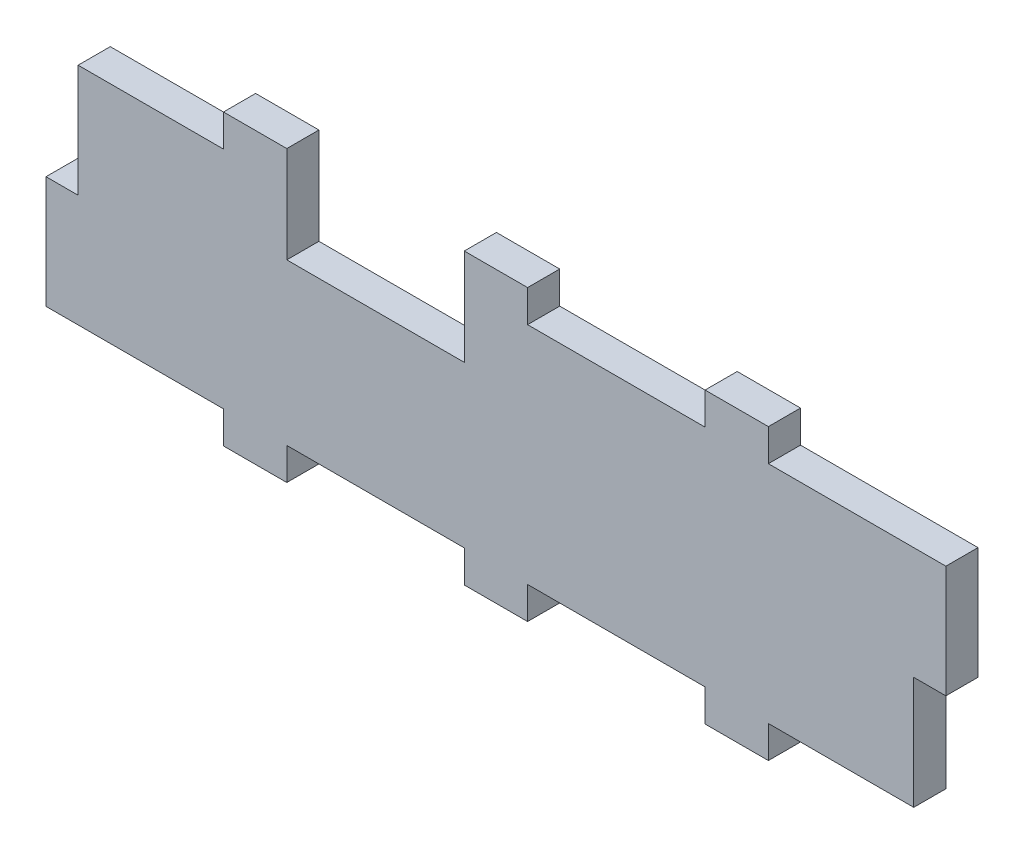
ISO-10303-21;
HEADER;
FILE_DESCRIPTION(('STEP AP214'),'2;1');
FILE_NAME('part.step','',(''),(''),'','','');
FILE_SCHEMA(('AUTOMOTIVE_DESIGN { 1 0 10303 214 1 1 1 1 }'));
ENDSEC;
DATA;
#1=APPLICATION_CONTEXT('core data for automotive mechanical design processes');
#2=APPLICATION_PROTOCOL_DEFINITION('international standard','automotive_design',2000,#1);
#3=PRODUCT_CONTEXT('',#1,'mechanical');
#4=PRODUCT('Part','Part','',(#3));
#5=PRODUCT_RELATED_PRODUCT_CATEGORY('part','',(#4));
#6=PRODUCT_DEFINITION_FORMATION('','',#4);
#7=PRODUCT_DEFINITION_CONTEXT('part definition',#1,'design');
#8=PRODUCT_DEFINITION('design','',#6,#7);
#9=PRODUCT_DEFINITION_SHAPE('','',#8);
#10=(LENGTH_UNIT() NAMED_UNIT(*) SI_UNIT(.MILLI.,.METRE.));
#11=(NAMED_UNIT(*) PLANE_ANGLE_UNIT() SI_UNIT($,.RADIAN.));
#12=(NAMED_UNIT(*) SI_UNIT($,.STERADIAN.) SOLID_ANGLE_UNIT());
#13=UNCERTAINTY_MEASURE_WITH_UNIT(LENGTH_MEASURE(1.E-05),#10,'distance_accuracy_value','');
#14=(GEOMETRIC_REPRESENTATION_CONTEXT(3) GLOBAL_UNCERTAINTY_ASSIGNED_CONTEXT((#13)) GLOBAL_UNIT_ASSIGNED_CONTEXT((#10,
#11,#12)) REPRESENTATION_CONTEXT('',''));
#15=CARTESIAN_POINT('',(0.,0.,0.));
#16=DIRECTION('',(0.,0.,1.));
#17=DIRECTION('',(1.,0.,0.));
#18=AXIS2_PLACEMENT_3D('',#15,#16,#17);
#19=CARTESIAN_POINT('',(0.,-17.5,5.));
#20=DIRECTION('',(0.,1.,0.));
#21=DIRECTION('',(-1.,0.,0.));
#22=AXIS2_PLACEMENT_3D('',#19,#20,#21);
#23=PLANE('',#22);
#24=DIRECTION('',(1.,0.,0.));
#25=VECTOR('',#24,1.);
#26=CARTESIAN_POINT('',(0.,-17.5,0.));
#27=LINE('',#26,#25);
#28=CARTESIAN_POINT('',(-70.,-17.5,0.));
#29=VERTEX_POINT('',#28);
#30=CARTESIAN_POINT('',(-42.3875,-17.5,0.));
#31=VERTEX_POINT('',#30);
#32=EDGE_CURVE('E284',#29,#31,#27,.T.);
#33=ORIENTED_EDGE('',*,*,#32,.T.);
#34=DIRECTION('',(0.,0.,-1.));
#35=VECTOR('',#34,1.);
#36=CARTESIAN_POINT('',(-42.3875,-17.5,5.));
#37=LINE('',#36,#35);
#38=CARTESIAN_POINT('',(-42.3875,-17.5,5.));
#39=VERTEX_POINT('',#38);
#40=EDGE_CURVE('E11',#39,#31,#37,.T.);
#41=ORIENTED_EDGE('',*,*,#40,.F.);
#42=DIRECTION('',(1.,0.,0.));
#43=VECTOR('',#42,1.);
#44=CARTESIAN_POINT('',(0.,-17.5,5.));
#45=LINE('',#44,#43);
#46=CARTESIAN_POINT('',(-70.,-17.5,5.));
#47=VERTEX_POINT('',#46);
#48=EDGE_CURVE('E358',#47,#39,#45,.T.);
#49=ORIENTED_EDGE('',*,*,#48,.F.);
#50=DIRECTION('',(0.,0.,-1.));
#51=VECTOR('',#50,1.);
#52=CARTESIAN_POINT('',(-70.,-17.5,5.));
#53=LINE('',#52,#51);
#54=EDGE_CURVE('E61',#47,#29,#53,.T.);
#55=ORIENTED_EDGE('',*,*,#54,.T.);
#56=EDGE_LOOP('',(#33,#41,#49,#55));
#57=FACE_BOUND('',#56,.T.);
#58=ADVANCED_FACE('F37',(#57),#23,.F.);
#59=CARTESIAN_POINT('',(-42.3875,0.,5.));
#60=DIRECTION('',(1.,0.,0.));
#61=DIRECTION('',(0.,0.,-1.));
#62=AXIS2_PLACEMENT_3D('',#59,#60,#61);
#63=PLANE('',#62);
#64=DIRECTION('',(0.,-1.,0.));
#65=VECTOR('',#64,1.);
#66=CARTESIAN_POINT('',(-42.3875,0.,0.));
#67=LINE('',#66,#65);
#68=CARTESIAN_POINT('',(-42.3875,-22.5,0.));
#69=VERTEX_POINT('',#68);
#70=EDGE_CURVE('E286',#31,#69,#67,.T.);
#71=ORIENTED_EDGE('',*,*,#70,.T.);
#72=DIRECTION('',(0.,0.,-1.));
#73=VECTOR('',#72,1.);
#74=CARTESIAN_POINT('',(-42.3875,-22.5,5.));
#75=LINE('',#74,#73);
#76=CARTESIAN_POINT('',(-42.3875,-22.5,5.));
#77=VERTEX_POINT('',#76);
#78=EDGE_CURVE('E45',#77,#69,#75,.T.);
#79=ORIENTED_EDGE('',*,*,#78,.F.);
#80=DIRECTION('',(0.,-1.,0.));
#81=VECTOR('',#80,1.);
#82=CARTESIAN_POINT('',(-42.3875,0.,5.));
#83=LINE('',#82,#81);
#84=EDGE_CURVE('E165',#39,#77,#83,.T.);
#85=ORIENTED_EDGE('',*,*,#84,.F.);
#86=ORIENTED_EDGE('',*,*,#40,.T.);
#87=EDGE_LOOP('',(#71,#79,#85,#86));
#88=FACE_BOUND('',#87,.T.);
#89=ADVANCED_FACE('F39',(#88),#63,.F.);
#90=CARTESIAN_POINT('',(0.,-22.5,5.));
#91=DIRECTION('',(0.,1.,0.));
#92=DIRECTION('',(0.,0.,1.));
#93=AXIS2_PLACEMENT_3D('',#90,#91,#92);
#94=PLANE('',#93);
#95=DIRECTION('',(1.,0.,0.));
#96=VECTOR('',#95,1.);
#97=CARTESIAN_POINT('',(0.,-22.5,0.));
#98=LINE('',#97,#96);
#99=CARTESIAN_POINT('',(-32.5375,-22.5,0.));
#100=VERTEX_POINT('',#99);
#101=EDGE_CURVE('E291',#69,#100,#98,.T.);
#102=ORIENTED_EDGE('',*,*,#101,.T.);
#103=DIRECTION('',(0.,0.,-1.));
#104=VECTOR('',#103,1.);
#105=CARTESIAN_POINT('',(-32.5375,-22.5,5.));
#106=LINE('',#105,#104);
#107=CARTESIAN_POINT('',(-32.5375,-22.5,5.));
#108=VERTEX_POINT('',#107);
#109=EDGE_CURVE('E414',#108,#100,#106,.T.);
#110=ORIENTED_EDGE('',*,*,#109,.F.);
#111=DIRECTION('',(1.,0.,0.));
#112=VECTOR('',#111,1.);
#113=CARTESIAN_POINT('',(0.,-22.5,5.));
#114=LINE('',#113,#112);
#115=EDGE_CURVE('E421',#77,#108,#114,.T.);
#116=ORIENTED_EDGE('',*,*,#115,.F.);
#117=ORIENTED_EDGE('',*,*,#78,.T.);
#118=EDGE_LOOP('',(#102,#110,#116,#117));
#119=FACE_BOUND('',#118,.T.);
#120=ADVANCED_FACE('F419',(#119),#94,.F.);
#121=CARTESIAN_POINT('',(-32.5375,0.,5.));
#122=DIRECTION('',(1.,0.,0.));
#123=DIRECTION('',(0.,0.,-1.));
#124=AXIS2_PLACEMENT_3D('',#121,#122,#123);
#125=PLANE('',#124);
#126=DIRECTION('',(0.,-1.,0.));
#127=VECTOR('',#126,1.);
#128=CARTESIAN_POINT('',(-32.5375,0.,0.));
#129=LINE('',#128,#127);
#130=CARTESIAN_POINT('',(-32.5375,-17.5,0.));
#131=VERTEX_POINT('',#130);
#132=EDGE_CURVE('E294',#131,#100,#129,.T.);
#133=ORIENTED_EDGE('',*,*,#132,.F.);
#134=DIRECTION('',(0.,0.,-1.));
#135=VECTOR('',#134,1.);
#136=CARTESIAN_POINT('',(-32.5375,-17.5,5.));
#137=LINE('',#136,#135);
#138=CARTESIAN_POINT('',(-32.5375,-17.5,5.));
#139=VERTEX_POINT('',#138);
#140=EDGE_CURVE('E412',#139,#131,#137,.T.);
#141=ORIENTED_EDGE('',*,*,#140,.F.);
#142=DIRECTION('',(0.,-1.,0.));
#143=VECTOR('',#142,1.);
#144=CARTESIAN_POINT('',(-32.5375,0.,5.));
#145=LINE('',#144,#143);
#146=EDGE_CURVE('E433',#139,#108,#145,.T.);
#147=ORIENTED_EDGE('',*,*,#146,.T.);
#148=ORIENTED_EDGE('',*,*,#109,.T.);
#149=EDGE_LOOP('',(#133,#141,#147,#148));
#150=FACE_BOUND('',#149,.T.);
#151=ADVANCED_FACE('F429',(#150),#125,.T.);
#152=CARTESIAN_POINT('',(-4.92499999999999,-17.5,0.));
#153=VERTEX_POINT('',#152);
#154=EDGE_CURVE('E289',#131,#153,#27,.T.);
#155=ORIENTED_EDGE('',*,*,#154,.T.);
#156=DIRECTION('',(0.,0.,-1.));
#157=VECTOR('',#156,1.);
#158=CARTESIAN_POINT('',(-4.92499999999999,-17.5,5.));
#159=LINE('',#158,#157);
#160=CARTESIAN_POINT('',(-4.92499999999999,-17.5,5.));
#161=VERTEX_POINT('',#160);
#162=EDGE_CURVE('E409',#161,#153,#159,.T.);
#163=ORIENTED_EDGE('',*,*,#162,.F.);
#164=EDGE_CURVE('E434',#139,#161,#45,.T.);
#165=ORIENTED_EDGE('',*,*,#164,.F.);
#166=ORIENTED_EDGE('',*,*,#140,.T.);
#167=EDGE_LOOP('',(#155,#163,#165,#166));
#168=FACE_BOUND('',#167,.T.);
#169=ADVANCED_FACE('F504',(#168),#23,.F.);
#170=CARTESIAN_POINT('',(-4.92499999999999,0.,5.));
#171=DIRECTION('',(1.,0.,0.));
#172=DIRECTION('',(0.,0.,-1.));
#173=AXIS2_PLACEMENT_3D('',#170,#171,#172);
#174=PLANE('',#173);
#175=DIRECTION('',(0.,-1.,0.));
#176=VECTOR('',#175,1.);
#177=CARTESIAN_POINT('',(-4.92499999999999,0.,0.));
#178=LINE('',#177,#176);
#179=CARTESIAN_POINT('',(-4.92499999999999,-22.5,0.));
#180=VERTEX_POINT('',#179);
#181=EDGE_CURVE('E297',#153,#180,#178,.T.);
#182=ORIENTED_EDGE('',*,*,#181,.T.);
#183=DIRECTION('',(0.,0.,-1.));
#184=VECTOR('',#183,1.);
#185=CARTESIAN_POINT('',(-4.92499999999999,-22.5,5.));
#186=LINE('',#185,#184);
#187=CARTESIAN_POINT('',(-4.92499999999999,-22.5,5.));
#188=VERTEX_POINT('',#187);
#189=EDGE_CURVE('E406',#188,#180,#186,.T.);
#190=ORIENTED_EDGE('',*,*,#189,.F.);
#191=DIRECTION('',(0.,-1.,0.));
#192=VECTOR('',#191,1.);
#193=CARTESIAN_POINT('',(-4.92499999999999,0.,5.));
#194=LINE('',#193,#192);
#195=EDGE_CURVE('E436',#161,#188,#194,.T.);
#196=ORIENTED_EDGE('',*,*,#195,.F.);
#197=ORIENTED_EDGE('',*,*,#162,.T.);
#198=EDGE_LOOP('',(#182,#190,#196,#197));
#199=FACE_BOUND('',#198,.T.);
#200=ADVANCED_FACE('F511',(#199),#174,.F.);
#201=CARTESIAN_POINT('',(0.,-22.5,5.));
#202=DIRECTION('',(0.,1.,0.));
#203=DIRECTION('',(0.,0.,1.));
#204=AXIS2_PLACEMENT_3D('',#201,#202,#203);
#205=PLANE('',#204);
#206=DIRECTION('',(1.,0.,0.));
#207=VECTOR('',#206,1.);
#208=CARTESIAN_POINT('',(0.,-22.5,0.));
#209=LINE('',#208,#207);
#210=CARTESIAN_POINT('',(4.92500000000001,-22.5,0.));
#211=VERTEX_POINT('',#210);
#212=EDGE_CURVE('E299',#180,#211,#209,.T.);
#213=ORIENTED_EDGE('',*,*,#212,.T.);
#214=DIRECTION('',(0.,0.,-1.));
#215=VECTOR('',#214,1.);
#216=CARTESIAN_POINT('',(4.92500000000001,-22.5,5.));
#217=LINE('',#216,#215);
#218=CARTESIAN_POINT('',(4.92500000000001,-22.5,5.));
#219=VERTEX_POINT('',#218);
#220=EDGE_CURVE('E404',#219,#211,#217,.T.);
#221=ORIENTED_EDGE('',*,*,#220,.F.);
#222=DIRECTION('',(1.,0.,0.));
#223=VECTOR('',#222,1.);
#224=CARTESIAN_POINT('',(0.,-22.5,5.));
#225=LINE('',#224,#223);
#226=EDGE_CURVE('E443',#188,#219,#225,.T.);
#227=ORIENTED_EDGE('',*,*,#226,.F.);
#228=ORIENTED_EDGE('',*,*,#189,.T.);
#229=EDGE_LOOP('',(#213,#221,#227,#228));
#230=FACE_BOUND('',#229,.T.);
#231=ADVANCED_FACE('F536',(#230),#205,.F.);
#232=CARTESIAN_POINT('',(4.92500000000001,0.,5.));
#233=DIRECTION('',(1.,0.,0.));
#234=DIRECTION('',(0.,0.,-1.));
#235=AXIS2_PLACEMENT_3D('',#232,#233,#234);
#236=PLANE('',#235);
#237=DIRECTION('',(0.,-1.,0.));
#238=VECTOR('',#237,1.);
#239=CARTESIAN_POINT('',(4.92500000000001,0.,0.));
#240=LINE('',#239,#238);
#241=CARTESIAN_POINT('',(4.92500000000001,-17.5,0.));
#242=VERTEX_POINT('',#241);
#243=EDGE_CURVE('E302',#242,#211,#240,.T.);
#244=ORIENTED_EDGE('',*,*,#243,.F.);
#245=DIRECTION('',(0.,0.,-1.));
#246=VECTOR('',#245,1.);
#247=CARTESIAN_POINT('',(4.92500000000001,-17.5,5.));
#248=LINE('',#247,#246);
#249=CARTESIAN_POINT('',(4.92500000000001,-17.5,5.));
#250=VERTEX_POINT('',#249);
#251=EDGE_CURVE('E402',#250,#242,#248,.T.);
#252=ORIENTED_EDGE('',*,*,#251,.F.);
#253=DIRECTION('',(0.,-1.,0.));
#254=VECTOR('',#253,1.);
#255=CARTESIAN_POINT('',(4.92500000000001,0.,5.));
#256=LINE('',#255,#254);
#257=EDGE_CURVE('E445',#250,#219,#256,.T.);
#258=ORIENTED_EDGE('',*,*,#257,.T.);
#259=ORIENTED_EDGE('',*,*,#220,.T.);
#260=EDGE_LOOP('',(#244,#252,#258,#259));
#261=FACE_BOUND('',#260,.T.);
#262=ADVANCED_FACE('F528',(#261),#236,.T.);
#263=CARTESIAN_POINT('',(32.5375,-17.5,0.));
#264=VERTEX_POINT('',#263);
#265=EDGE_CURVE('E305',#242,#264,#27,.T.);
#266=ORIENTED_EDGE('',*,*,#265,.T.);
#267=DIRECTION('',(0.,0.,-1.));
#268=VECTOR('',#267,1.);
#269=CARTESIAN_POINT('',(32.5375,-17.5,5.));
#270=LINE('',#269,#268);
#271=CARTESIAN_POINT('',(32.5375,-17.5,5.));
#272=VERTEX_POINT('',#271);
#273=EDGE_CURVE('E399',#272,#264,#270,.T.);
#274=ORIENTED_EDGE('',*,*,#273,.F.);
#275=EDGE_CURVE('E438',#250,#272,#45,.T.);
#276=ORIENTED_EDGE('',*,*,#275,.F.);
#277=ORIENTED_EDGE('',*,*,#251,.T.);
#278=EDGE_LOOP('',(#266,#274,#276,#277));
#279=FACE_BOUND('',#278,.T.);
#280=ADVANCED_FACE('F513',(#279),#23,.F.);
#281=CARTESIAN_POINT('',(32.5375,0.,5.));
#282=DIRECTION('',(1.,0.,0.));
#283=DIRECTION('',(0.,0.,-1.));
#284=AXIS2_PLACEMENT_3D('',#281,#282,#283);
#285=PLANE('',#284);
#286=DIRECTION('',(0.,-1.,0.));
#287=VECTOR('',#286,1.);
#288=CARTESIAN_POINT('',(32.5375,0.,0.));
#289=LINE('',#288,#287);
#290=CARTESIAN_POINT('',(32.5375,-22.5,0.));
#291=VERTEX_POINT('',#290);
#292=EDGE_CURVE('E306',#264,#291,#289,.T.);
#293=ORIENTED_EDGE('',*,*,#292,.T.);
#294=DIRECTION('',(0.,0.,-1.));
#295=VECTOR('',#294,1.);
#296=CARTESIAN_POINT('',(32.5375,-22.5,5.));
#297=LINE('',#296,#295);
#298=CARTESIAN_POINT('',(32.5375,-22.5,5.));
#299=VERTEX_POINT('',#298);
#300=EDGE_CURVE('E396',#299,#291,#297,.T.);
#301=ORIENTED_EDGE('',*,*,#300,.F.);
#302=DIRECTION('',(0.,-1.,0.));
#303=VECTOR('',#302,1.);
#304=CARTESIAN_POINT('',(32.5375,0.,5.));
#305=LINE('',#304,#303);
#306=EDGE_CURVE('E448',#272,#299,#305,.T.);
#307=ORIENTED_EDGE('',*,*,#306,.F.);
#308=ORIENTED_EDGE('',*,*,#273,.T.);
#309=EDGE_LOOP('',(#293,#301,#307,#308));
#310=FACE_BOUND('',#309,.T.);
#311=ADVANCED_FACE('F527',(#310),#285,.F.);
#312=CARTESIAN_POINT('',(0.,-22.5,5.));
#313=DIRECTION('',(0.,1.,0.));
#314=DIRECTION('',(0.,0.,1.));
#315=AXIS2_PLACEMENT_3D('',#312,#313,#314);
#316=PLANE('',#315);
#317=DIRECTION('',(1.,0.,0.));
#318=VECTOR('',#317,1.);
#319=CARTESIAN_POINT('',(0.,-22.5,0.));
#320=LINE('',#319,#318);
#321=CARTESIAN_POINT('',(42.3875,-22.5,0.));
#322=VERTEX_POINT('',#321);
#323=EDGE_CURVE('E308',#291,#322,#320,.T.);
#324=ORIENTED_EDGE('',*,*,#323,.T.);
#325=DIRECTION('',(0.,0.,-1.));
#326=VECTOR('',#325,1.);
#327=CARTESIAN_POINT('',(42.3875,-22.5,5.));
#328=LINE('',#327,#326);
#329=CARTESIAN_POINT('',(42.3875,-22.5,5.));
#330=VERTEX_POINT('',#329);
#331=EDGE_CURVE('E394',#330,#322,#328,.T.);
#332=ORIENTED_EDGE('',*,*,#331,.F.);
#333=DIRECTION('',(1.,0.,0.));
#334=VECTOR('',#333,1.);
#335=CARTESIAN_POINT('',(0.,-22.5,5.));
#336=LINE('',#335,#334);
#337=EDGE_CURVE('E450',#299,#330,#336,.T.);
#338=ORIENTED_EDGE('',*,*,#337,.F.);
#339=ORIENTED_EDGE('',*,*,#300,.T.);
#340=EDGE_LOOP('',(#324,#332,#338,#339));
#341=FACE_BOUND('',#340,.T.);
#342=ADVANCED_FACE('F524',(#341),#316,.F.);
#343=CARTESIAN_POINT('',(42.3875,0.,5.));
#344=DIRECTION('',(1.,0.,0.));
#345=DIRECTION('',(0.,0.,-1.));
#346=AXIS2_PLACEMENT_3D('',#343,#344,#345);
#347=PLANE('',#346);
#348=DIRECTION('',(0.,-1.,0.));
#349=VECTOR('',#348,1.);
#350=CARTESIAN_POINT('',(42.3875,0.,0.));
#351=LINE('',#350,#349);
#352=CARTESIAN_POINT('',(42.3875,-17.5,0.));
#353=VERTEX_POINT('',#352);
#354=EDGE_CURVE('E311',#353,#322,#351,.T.);
#355=ORIENTED_EDGE('',*,*,#354,.F.);
#356=DIRECTION('',(0.,0.,-1.));
#357=VECTOR('',#356,1.);
#358=CARTESIAN_POINT('',(42.3875,-17.5,5.));
#359=LINE('',#358,#357);
#360=CARTESIAN_POINT('',(42.3875,-17.5,5.));
#361=VERTEX_POINT('',#360);
#362=EDGE_CURVE('E392',#361,#353,#359,.T.);
#363=ORIENTED_EDGE('',*,*,#362,.F.);
#364=DIRECTION('',(0.,-1.,0.));
#365=VECTOR('',#364,1.);
#366=CARTESIAN_POINT('',(42.3875,0.,5.));
#367=LINE('',#366,#365);
#368=EDGE_CURVE('E452',#361,#330,#367,.T.);
#369=ORIENTED_EDGE('',*,*,#368,.T.);
#370=ORIENTED_EDGE('',*,*,#331,.T.);
#371=EDGE_LOOP('',(#355,#363,#369,#370));
#372=FACE_BOUND('',#371,.T.);
#373=ADVANCED_FACE('F516',(#372),#347,.T.);
#374=CARTESIAN_POINT('',(65.,-17.5,0.));
#375=VERTEX_POINT('',#374);
#376=EDGE_CURVE('E288',#353,#375,#27,.T.);
#377=ORIENTED_EDGE('',*,*,#376,.T.);
#378=DIRECTION('',(0.,0.,-1.));
#379=VECTOR('',#378,1.);
#380=CARTESIAN_POINT('',(65.,-17.5,5.));
#381=LINE('',#380,#379);
#382=CARTESIAN_POINT('',(65.,-17.5,5.));
#383=VERTEX_POINT('',#382);
#384=EDGE_CURVE('E389',#383,#375,#381,.T.);
#385=ORIENTED_EDGE('',*,*,#384,.F.);
#386=EDGE_CURVE('E455',#361,#383,#45,.T.);
#387=ORIENTED_EDGE('',*,*,#386,.F.);
#388=ORIENTED_EDGE('',*,*,#362,.T.);
#389=EDGE_LOOP('',(#377,#385,#387,#388));
#390=FACE_BOUND('',#389,.T.);
#391=ADVANCED_FACE('F505',(#390),#23,.F.);
#392=CARTESIAN_POINT('',(65.,0.,5.));
#393=DIRECTION('',(-1.,0.,0.));
#394=DIRECTION('',(0.,0.,1.));
#395=AXIS2_PLACEMENT_3D('',#392,#393,#394);
#396=PLANE('',#395);
#397=DIRECTION('',(0.,1.,0.));
#398=VECTOR('',#397,1.);
#399=CARTESIAN_POINT('',(65.,0.,0.));
#400=LINE('',#399,#398);
#401=CARTESIAN_POINT('',(65.,0.0249999999999972,0.));
#402=VERTEX_POINT('',#401);
#403=EDGE_CURVE('E314',#375,#402,#400,.T.);
#404=ORIENTED_EDGE('',*,*,#403,.T.);
#405=DIRECTION('',(0.,0.,-1.));
#406=VECTOR('',#405,1.);
#407=CARTESIAN_POINT('',(65.,0.0249999999999972,5.));
#408=LINE('',#407,#406);
#409=CARTESIAN_POINT('',(65.,0.0249999999999972,5.));
#410=VERTEX_POINT('',#409);
#411=EDGE_CURVE('E386',#410,#402,#408,.T.);
#412=ORIENTED_EDGE('',*,*,#411,.F.);
#413=DIRECTION('',(0.,1.,0.));
#414=VECTOR('',#413,1.);
#415=CARTESIAN_POINT('',(65.,0.,5.));
#416=LINE('',#415,#414);
#417=EDGE_CURVE('E456',#383,#410,#416,.T.);
#418=ORIENTED_EDGE('',*,*,#417,.F.);
#419=ORIENTED_EDGE('',*,*,#384,.T.);
#420=EDGE_LOOP('',(#404,#412,#418,#419));
#421=FACE_BOUND('',#420,.T.);
#422=ADVANCED_FACE('F515',(#421),#396,.F.);
#423=CARTESIAN_POINT('',(0.,0.0249999999999972,5.));
#424=DIRECTION('',(0.,1.,0.));
#425=DIRECTION('',(0.,0.,1.));
#426=AXIS2_PLACEMENT_3D('',#423,#424,#425);
#427=PLANE('',#426);
#428=DIRECTION('',(1.,0.,0.));
#429=VECTOR('',#428,1.);
#430=CARTESIAN_POINT('',(0.,0.0249999999999972,0.));
#431=LINE('',#430,#429);
#432=CARTESIAN_POINT('',(70.,0.0249999999999972,0.));
#433=VERTEX_POINT('',#432);
#434=EDGE_CURVE('E316',#402,#433,#431,.T.);
#435=ORIENTED_EDGE('',*,*,#434,.T.);
#436=DIRECTION('',(0.,0.,-1.));
#437=VECTOR('',#436,1.);
#438=CARTESIAN_POINT('',(70.,0.0249999999999972,5.));
#439=LINE('',#438,#437);
#440=CARTESIAN_POINT('',(70.,0.0249999999999972,5.));
#441=VERTEX_POINT('',#440);
#442=EDGE_CURVE('E384',#441,#433,#439,.T.);
#443=ORIENTED_EDGE('',*,*,#442,.F.);
#444=DIRECTION('',(1.,0.,0.));
#445=VECTOR('',#444,1.);
#446=CARTESIAN_POINT('',(0.,0.0249999999999972,5.));
#447=LINE('',#446,#445);
#448=EDGE_CURVE('E458',#410,#441,#447,.T.);
#449=ORIENTED_EDGE('',*,*,#448,.F.);
#450=ORIENTED_EDGE('',*,*,#411,.T.);
#451=EDGE_LOOP('',(#435,#443,#449,#450));
#452=FACE_BOUND('',#451,.T.);
#453=ADVANCED_FACE('F522',(#452),#427,.F.);
#454=CARTESIAN_POINT('',(70.,0.,5.));
#455=DIRECTION('',(1.,0.,0.));
#456=DIRECTION('',(0.,0.,-1.));
#457=AXIS2_PLACEMENT_3D('',#454,#455,#456);
#458=PLANE('',#457);
#459=DIRECTION('',(0.,-1.,0.));
#460=VECTOR('',#459,1.);
#461=CARTESIAN_POINT('',(70.,0.,0.));
#462=LINE('',#461,#460);
#463=CARTESIAN_POINT('',(70.,17.5,0.));
#464=VERTEX_POINT('',#463);
#465=EDGE_CURVE('E319',#464,#433,#462,.T.);
#466=ORIENTED_EDGE('',*,*,#465,.F.);
#467=DIRECTION('',(0.,0.,-1.));
#468=VECTOR('',#467,1.);
#469=CARTESIAN_POINT('',(70.,17.5,5.));
#470=LINE('',#469,#468);
#471=CARTESIAN_POINT('',(70.,17.5,5.));
#472=VERTEX_POINT('',#471);
#473=EDGE_CURVE('E382',#472,#464,#470,.T.);
#474=ORIENTED_EDGE('',*,*,#473,.F.);
#475=DIRECTION('',(0.,-1.,0.));
#476=VECTOR('',#475,1.);
#477=CARTESIAN_POINT('',(70.,0.,5.));
#478=LINE('',#477,#476);
#479=EDGE_CURVE('E460',#472,#441,#478,.T.);
#480=ORIENTED_EDGE('',*,*,#479,.T.);
#481=ORIENTED_EDGE('',*,*,#442,.T.);
#482=EDGE_LOOP('',(#466,#474,#480,#481));
#483=FACE_BOUND('',#482,.T.);
#484=ADVANCED_FACE('F641',(#483),#458,.T.);
#485=CARTESIAN_POINT('',(0.,17.5,5.));
#486=DIRECTION('',(0.,1.,0.));
#487=DIRECTION('',(0.,0.,1.));
#488=AXIS2_PLACEMENT_3D('',#485,#486,#487);
#489=PLANE('',#488);
#490=DIRECTION('',(1.,0.,0.));
#491=VECTOR('',#490,1.);
#492=CARTESIAN_POINT('',(0.,17.5,0.));
#493=LINE('',#492,#491);
#494=CARTESIAN_POINT('',(42.3874999999999,17.5,0.));
#495=VERTEX_POINT('',#494);
#496=EDGE_CURVE('E322',#495,#464,#493,.T.);
#497=ORIENTED_EDGE('',*,*,#496,.F.);
#498=DIRECTION('',(0.,0.,-1.));
#499=VECTOR('',#498,1.);
#500=CARTESIAN_POINT('',(42.3874999999999,17.5,5.));
#501=LINE('',#500,#499);
#502=CARTESIAN_POINT('',(42.3874999999999,17.5,5.));
#503=VERTEX_POINT('',#502);
#504=EDGE_CURVE('E380',#503,#495,#501,.T.);
#505=ORIENTED_EDGE('',*,*,#504,.F.);
#506=DIRECTION('',(1.,0.,0.));
#507=VECTOR('',#506,1.);
#508=CARTESIAN_POINT('',(0.,17.5,5.));
#509=LINE('',#508,#507);
#510=EDGE_CURVE('E279',#503,#472,#509,.T.);
#511=ORIENTED_EDGE('',*,*,#510,.T.);
#512=ORIENTED_EDGE('',*,*,#473,.T.);
#513=EDGE_LOOP('',(#497,#505,#511,#512));
#514=FACE_BOUND('',#513,.T.);
#515=ADVANCED_FACE('F570',(#514),#489,.T.);
#516=CARTESIAN_POINT('',(42.3874999999999,0.,5.));
#517=DIRECTION('',(1.,0.,0.));
#518=DIRECTION('',(0.,0.,-1.));
#519=AXIS2_PLACEMENT_3D('',#516,#517,#518);
#520=PLANE('',#519);
#521=DIRECTION('',(0.,-1.,0.));
#522=VECTOR('',#521,1.);
#523=CARTESIAN_POINT('',(42.3874999999999,0.,0.));
#524=LINE('',#523,#522);
#525=CARTESIAN_POINT('',(42.3874999999999,22.5,0.));
#526=VERTEX_POINT('',#525);
#527=EDGE_CURVE('E325',#526,#495,#524,.T.);
#528=ORIENTED_EDGE('',*,*,#527,.F.);
#529=DIRECTION('',(0.,0.,-1.));
#530=VECTOR('',#529,1.);
#531=CARTESIAN_POINT('',(42.3874999999999,22.5,5.));
#532=LINE('',#531,#530);
#533=CARTESIAN_POINT('',(42.3874999999999,22.5,5.));
#534=VERTEX_POINT('',#533);
#535=EDGE_CURVE('E378',#534,#526,#532,.T.);
#536=ORIENTED_EDGE('',*,*,#535,.F.);
#537=DIRECTION('',(0.,-1.,0.));
#538=VECTOR('',#537,1.);
#539=CARTESIAN_POINT('',(42.3874999999999,0.,5.));
#540=LINE('',#539,#538);
#541=EDGE_CURVE('E464',#534,#503,#540,.T.);
#542=ORIENTED_EDGE('',*,*,#541,.T.);
#543=ORIENTED_EDGE('',*,*,#504,.T.);
#544=EDGE_LOOP('',(#528,#536,#542,#543));
#545=FACE_BOUND('',#544,.T.);
#546=ADVANCED_FACE('F574',(#545),#520,.T.);
#547=CARTESIAN_POINT('',(0.,22.5,5.));
#548=DIRECTION('',(0.,1.,0.));
#549=DIRECTION('',(-1.,0.,0.));
#550=AXIS2_PLACEMENT_3D('',#547,#548,#549);
#551=PLANE('',#550);
#552=DIRECTION('',(1.,0.,0.));
#553=VECTOR('',#552,1.);
#554=CARTESIAN_POINT('',(0.,22.5,0.));
#555=LINE('',#554,#553);
#556=CARTESIAN_POINT('',(32.5374999999999,22.5,0.));
#557=VERTEX_POINT('',#556);
#558=EDGE_CURVE('E330',#557,#526,#555,.T.);
#559=ORIENTED_EDGE('',*,*,#558,.F.);
#560=DIRECTION('',(0.,0.,-1.));
#561=VECTOR('',#560,1.);
#562=CARTESIAN_POINT('',(32.5374999999999,22.5,5.));
#563=LINE('',#562,#561);
#564=CARTESIAN_POINT('',(32.5374999999999,22.5,5.));
#565=VERTEX_POINT('',#564);
#566=EDGE_CURVE('E376',#565,#557,#563,.T.);
#567=ORIENTED_EDGE('',*,*,#566,.F.);
#568=DIRECTION('',(1.,0.,0.));
#569=VECTOR('',#568,1.);
#570=CARTESIAN_POINT('',(0.,22.5,5.));
#571=LINE('',#570,#569);
#572=EDGE_CURVE('E467',#565,#534,#571,.T.);
#573=ORIENTED_EDGE('',*,*,#572,.T.);
#574=ORIENTED_EDGE('',*,*,#535,.T.);
#575=EDGE_LOOP('',(#559,#567,#573,#574));
#576=FACE_BOUND('',#575,.T.);
#577=ADVANCED_FACE('F578',(#576),#551,.T.);
#578=CARTESIAN_POINT('',(32.5374999999999,0.,5.));
#579=DIRECTION('',(1.,0.,0.));
#580=DIRECTION('',(0.,0.,-1.));
#581=AXIS2_PLACEMENT_3D('',#578,#579,#580);
#582=PLANE('',#581);
#583=DIRECTION('',(0.,-1.,0.));
#584=VECTOR('',#583,1.);
#585=CARTESIAN_POINT('',(32.5374999999999,0.,0.));
#586=LINE('',#585,#584);
#587=CARTESIAN_POINT('',(32.5374999999999,17.5,0.));
#588=VERTEX_POINT('',#587);
#589=EDGE_CURVE('E333',#557,#588,#586,.T.);
#590=ORIENTED_EDGE('',*,*,#589,.T.);
#591=DIRECTION('',(0.,0.,-1.));
#592=VECTOR('',#591,1.);
#593=CARTESIAN_POINT('',(32.5374999999999,17.5,5.));
#594=LINE('',#593,#592);
#595=CARTESIAN_POINT('',(32.5374999999999,17.5,5.));
#596=VERTEX_POINT('',#595);
#597=EDGE_CURVE('E374',#596,#588,#594,.T.);
#598=ORIENTED_EDGE('',*,*,#597,.F.);
#599=DIRECTION('',(0.,-1.,0.));
#600=VECTOR('',#599,1.);
#601=CARTESIAN_POINT('',(32.5374999999999,0.,5.));
#602=LINE('',#601,#600);
#603=EDGE_CURVE('E470',#565,#596,#602,.T.);
#604=ORIENTED_EDGE('',*,*,#603,.F.);
#605=ORIENTED_EDGE('',*,*,#566,.T.);
#606=EDGE_LOOP('',(#590,#598,#604,#605));
#607=FACE_BOUND('',#606,.T.);
#608=ADVANCED_FACE('F583',(#607),#582,.F.);
#609=CARTESIAN_POINT('',(4.92499999999987,17.5,0.));
#610=VERTEX_POINT('',#609);
#611=EDGE_CURVE('E327',#610,#588,#493,.T.);
#612=ORIENTED_EDGE('',*,*,#611,.F.);
#613=DIRECTION('',(0.,0.,-1.));
#614=VECTOR('',#613,1.);
#615=CARTESIAN_POINT('',(4.92499999999987,17.5,5.));
#616=LINE('',#615,#614);
#617=CARTESIAN_POINT('',(4.92499999999987,17.5,5.));
#618=VERTEX_POINT('',#617);
#619=EDGE_CURVE('E372',#618,#610,#616,.T.);
#620=ORIENTED_EDGE('',*,*,#619,.F.);
#621=EDGE_CURVE('E278',#618,#596,#509,.T.);
#622=ORIENTED_EDGE('',*,*,#621,.T.);
#623=ORIENTED_EDGE('',*,*,#597,.T.);
#624=EDGE_LOOP('',(#612,#620,#622,#623));
#625=FACE_BOUND('',#624,.T.);
#626=ADVANCED_FACE('F634',(#625),#489,.T.);
#627=CARTESIAN_POINT('',(4.92499999999987,0.,5.));
#628=DIRECTION('',(1.,0.,0.));
#629=DIRECTION('',(0.,0.,-1.));
#630=AXIS2_PLACEMENT_3D('',#627,#628,#629);
#631=PLANE('',#630);
#632=DIRECTION('',(0.,-1.,0.));
#633=VECTOR('',#632,1.);
#634=CARTESIAN_POINT('',(4.92499999999987,0.,0.));
#635=LINE('',#634,#633);
#636=CARTESIAN_POINT('',(4.92499999999987,22.5,0.));
#637=VERTEX_POINT('',#636);
#638=EDGE_CURVE('E336',#637,#610,#635,.T.);
#639=ORIENTED_EDGE('',*,*,#638,.F.);
#640=DIRECTION('',(0.,0.,-1.));
#641=VECTOR('',#640,1.);
#642=CARTESIAN_POINT('',(4.92499999999987,22.5,5.));
#643=LINE('',#642,#641);
#644=CARTESIAN_POINT('',(4.92499999999987,22.5,5.));
#645=VERTEX_POINT('',#644);
#646=EDGE_CURVE('E370',#645,#637,#643,.T.);
#647=ORIENTED_EDGE('',*,*,#646,.F.);
#648=DIRECTION('',(0.,-1.,0.));
#649=VECTOR('',#648,1.);
#650=CARTESIAN_POINT('',(4.92499999999987,0.,5.));
#651=LINE('',#650,#649);
#652=EDGE_CURVE('E472',#645,#618,#651,.T.);
#653=ORIENTED_EDGE('',*,*,#652,.T.);
#654=ORIENTED_EDGE('',*,*,#619,.T.);
#655=EDGE_LOOP('',(#639,#647,#653,#654));
#656=FACE_BOUND('',#655,.T.);
#657=ADVANCED_FACE('F591',(#656),#631,.T.);
#658=CARTESIAN_POINT('',(0.,22.5,5.));
#659=DIRECTION('',(0.,1.,0.));
#660=DIRECTION('',(-1.,0.,0.));
#661=AXIS2_PLACEMENT_3D('',#658,#659,#660);
#662=PLANE('',#661);
#663=DIRECTION('',(1.,0.,0.));
#664=VECTOR('',#663,1.);
#665=CARTESIAN_POINT('',(0.,22.5,0.));
#666=LINE('',#665,#664);
#667=CARTESIAN_POINT('',(-4.92500000000013,22.5,0.));
#668=VERTEX_POINT('',#667);
#669=EDGE_CURVE('E339',#668,#637,#666,.T.);
#670=ORIENTED_EDGE('',*,*,#669,.F.);
#671=DIRECTION('',(0.,0.,-1.));
#672=VECTOR('',#671,1.);
#673=CARTESIAN_POINT('',(-4.92500000000013,22.5,5.));
#674=LINE('',#673,#672);
#675=CARTESIAN_POINT('',(-4.92500000000013,22.5,5.));
#676=VERTEX_POINT('',#675);
#677=EDGE_CURVE('E368',#676,#668,#674,.T.);
#678=ORIENTED_EDGE('',*,*,#677,.F.);
#679=DIRECTION('',(1.,0.,0.));
#680=VECTOR('',#679,1.);
#681=CARTESIAN_POINT('',(0.,22.5,5.));
#682=LINE('',#681,#680);
#683=EDGE_CURVE('E475',#676,#645,#682,.T.);
#684=ORIENTED_EDGE('',*,*,#683,.T.);
#685=ORIENTED_EDGE('',*,*,#646,.T.);
#686=EDGE_LOOP('',(#670,#678,#684,#685));
#687=FACE_BOUND('',#686,.T.);
#688=ADVANCED_FACE('F595',(#687),#662,.T.);
#689=CARTESIAN_POINT('',(-4.92500000000013,0.,5.));
#690=DIRECTION('',(1.,0.,0.));
#691=DIRECTION('',(0.,0.,-1.));
#692=AXIS2_PLACEMENT_3D('',#689,#690,#691);
#693=PLANE('',#692);
#694=DIRECTION('',(0.,-1.,0.));
#695=VECTOR('',#694,1.);
#696=CARTESIAN_POINT('',(-4.92500000000013,0.,0.));
#697=LINE('',#696,#695);
#698=CARTESIAN_POINT('',(-4.92500000000013,7.5,0.));
#699=VERTEX_POINT('',#698);
#700=EDGE_CURVE('E52',#668,#699,#697,.T.);
#701=ORIENTED_EDGE('',*,*,#700,.T.);
#702=DIRECTION('',(0.,0.,-1.));
#703=VECTOR('',#702,1.);
#704=CARTESIAN_POINT('',(-4.92500000000013,7.5,5.));
#705=LINE('',#704,#703);
#706=CARTESIAN_POINT('',(-4.92500000000013,7.5,5.));
#707=VERTEX_POINT('',#706);
#708=EDGE_CURVE('E602',#707,#699,#705,.T.);
#709=ORIENTED_EDGE('',*,*,#708,.F.);
#710=DIRECTION('',(0.,-1.,0.));
#711=VECTOR('',#710,1.);
#712=CARTESIAN_POINT('',(-4.92500000000013,0.,5.));
#713=LINE('',#712,#711);
#714=EDGE_CURVE('E478',#676,#707,#713,.T.);
#715=ORIENTED_EDGE('',*,*,#714,.F.);
#716=ORIENTED_EDGE('',*,*,#677,.T.);
#717=EDGE_LOOP('',(#701,#709,#715,#716));
#718=FACE_BOUND('',#717,.T.);
#719=ADVANCED_FACE('F603',(#718),#693,.F.);
#720=CARTESIAN_POINT('',(-32.5375000000001,0.,5.));
#721=DIRECTION('',(1.,0.,0.));
#722=DIRECTION('',(0.,0.,-1.));
#723=AXIS2_PLACEMENT_3D('',#720,#721,#722);
#724=PLANE('',#723);
#725=DIRECTION('',(0.,-1.,0.));
#726=VECTOR('',#725,1.);
#727=CARTESIAN_POINT('',(-32.5375000000001,0.,0.));
#728=LINE('',#727,#726);
#729=CARTESIAN_POINT('',(-32.5375000000001,22.5,0.));
#730=VERTEX_POINT('',#729);
#731=CARTESIAN_POINT('',(-32.5375000000001,7.5,0.));
#732=VERTEX_POINT('',#731);
#733=EDGE_CURVE('E343',#730,#732,#728,.T.);
#734=ORIENTED_EDGE('',*,*,#733,.F.);
#735=DIRECTION('',(0.,0.,-1.));
#736=VECTOR('',#735,1.);
#737=CARTESIAN_POINT('',(-32.5375000000001,22.5,5.));
#738=LINE('',#737,#736);
#739=CARTESIAN_POINT('',(-32.5375000000001,22.5,5.));
#740=VERTEX_POINT('',#739);
#741=EDGE_CURVE('E366',#740,#730,#738,.T.);
#742=ORIENTED_EDGE('',*,*,#741,.F.);
#743=DIRECTION('',(0.,-1.,0.));
#744=VECTOR('',#743,1.);
#745=CARTESIAN_POINT('',(-32.5375000000001,0.,5.));
#746=LINE('',#745,#744);
#747=CARTESIAN_POINT('',(-32.5375000000001,7.5,5.));
#748=VERTEX_POINT('',#747);
#749=EDGE_CURVE('E480',#740,#748,#746,.T.);
#750=ORIENTED_EDGE('',*,*,#749,.T.);
#751=DIRECTION('',(0.,0.,-1.));
#752=VECTOR('',#751,1.);
#753=CARTESIAN_POINT('',(-32.5375000000001,7.5,5.));
#754=LINE('',#753,#752);
#755=EDGE_CURVE('E287',#748,#732,#754,.T.);
#756=ORIENTED_EDGE('',*,*,#755,.T.);
#757=EDGE_LOOP('',(#734,#742,#750,#756));
#758=FACE_BOUND('',#757,.T.);
#759=ADVANCED_FACE('F615',(#758),#724,.T.);
#760=CARTESIAN_POINT('',(0.,22.5,5.));
#761=DIRECTION('',(0.,1.,0.));
#762=DIRECTION('',(-1.,0.,0.));
#763=AXIS2_PLACEMENT_3D('',#760,#761,#762);
#764=PLANE('',#763);
#765=DIRECTION('',(1.,0.,0.));
#766=VECTOR('',#765,1.);
#767=CARTESIAN_POINT('',(0.,22.5,0.));
#768=LINE('',#767,#766);
#769=CARTESIAN_POINT('',(-42.3875000000001,22.5,0.));
#770=VERTEX_POINT('',#769);
#771=EDGE_CURVE('E346',#770,#730,#768,.T.);
#772=ORIENTED_EDGE('',*,*,#771,.F.);
#773=DIRECTION('',(0.,0.,-1.));
#774=VECTOR('',#773,1.);
#775=CARTESIAN_POINT('',(-42.3875000000001,22.5,5.));
#776=LINE('',#775,#774);
#777=CARTESIAN_POINT('',(-42.3875000000001,22.5,5.));
#778=VERTEX_POINT('',#777);
#779=EDGE_CURVE('E364',#778,#770,#776,.T.);
#780=ORIENTED_EDGE('',*,*,#779,.F.);
#781=DIRECTION('',(1.,0.,0.));
#782=VECTOR('',#781,1.);
#783=CARTESIAN_POINT('',(0.,22.5,5.));
#784=LINE('',#783,#782);
#785=EDGE_CURVE('E482',#778,#740,#784,.T.);
#786=ORIENTED_EDGE('',*,*,#785,.T.);
#787=ORIENTED_EDGE('',*,*,#741,.T.);
#788=EDGE_LOOP('',(#772,#780,#786,#787));
#789=FACE_BOUND('',#788,.T.);
#790=ADVANCED_FACE('F617',(#789),#764,.T.);
#791=CARTESIAN_POINT('',(-42.3875000000001,0.,5.));
#792=DIRECTION('',(1.,0.,0.));
#793=DIRECTION('',(0.,0.,-1.));
#794=AXIS2_PLACEMENT_3D('',#791,#792,#793);
#795=PLANE('',#794);
#796=DIRECTION('',(0.,-1.,0.));
#797=VECTOR('',#796,1.);
#798=CARTESIAN_POINT('',(-42.3875000000001,0.,0.));
#799=LINE('',#798,#797);
#800=CARTESIAN_POINT('',(-42.3875000000001,17.5,0.));
#801=VERTEX_POINT('',#800);
#802=EDGE_CURVE('E349',#770,#801,#799,.T.);
#803=ORIENTED_EDGE('',*,*,#802,.T.);
#804=DIRECTION('',(0.,0.,-1.));
#805=VECTOR('',#804,1.);
#806=CARTESIAN_POINT('',(-42.3875000000001,17.5,5.));
#807=LINE('',#806,#805);
#808=CARTESIAN_POINT('',(-42.3875000000001,17.5,5.));
#809=VERTEX_POINT('',#808);
#810=EDGE_CURVE('E362',#809,#801,#807,.T.);
#811=ORIENTED_EDGE('',*,*,#810,.F.);
#812=DIRECTION('',(0.,-1.,0.));
#813=VECTOR('',#812,1.);
#814=CARTESIAN_POINT('',(-42.3875000000001,0.,5.));
#815=LINE('',#814,#813);
#816=EDGE_CURVE('E276',#778,#809,#815,.T.);
#817=ORIENTED_EDGE('',*,*,#816,.F.);
#818=ORIENTED_EDGE('',*,*,#779,.T.);
#819=EDGE_LOOP('',(#803,#811,#817,#818));
#820=FACE_BOUND('',#819,.T.);
#821=ADVANCED_FACE('F490',(#820),#795,.F.);
#822=CARTESIAN_POINT('',(-65.,17.5,0.));
#823=VERTEX_POINT('',#822);
#824=EDGE_CURVE('E326',#823,#801,#493,.T.);
#825=ORIENTED_EDGE('',*,*,#824,.F.);
#826=DIRECTION('',(0.,0.,-1.));
#827=VECTOR('',#826,1.);
#828=CARTESIAN_POINT('',(-65.,17.5,5.));
#829=LINE('',#828,#827);
#830=CARTESIAN_POINT('',(-65.,17.5,5.));
#831=VERTEX_POINT('',#830);
#832=EDGE_CURVE('E260',#831,#823,#829,.T.);
#833=ORIENTED_EDGE('',*,*,#832,.F.);
#834=EDGE_CURVE('E274',#831,#809,#509,.T.);
#835=ORIENTED_EDGE('',*,*,#834,.T.);
#836=ORIENTED_EDGE('',*,*,#810,.T.);
#837=EDGE_LOOP('',(#825,#833,#835,#836));
#838=FACE_BOUND('',#837,.T.);
#839=ADVANCED_FACE('F495',(#838),#489,.T.);
#840=CARTESIAN_POINT('',(-65.,0.,5.));
#841=DIRECTION('',(-1.,0.,0.));
#842=DIRECTION('',(0.,0.,1.));
#843=AXIS2_PLACEMENT_3D('',#840,#841,#842);
#844=PLANE('',#843);
#845=DIRECTION('',(0.,1.,0.));
#846=VECTOR('',#845,1.);
#847=CARTESIAN_POINT('',(-65.,0.,0.));
#848=LINE('',#847,#846);
#849=CARTESIAN_POINT('',(-65.,-0.0250000000000053,0.));
#850=VERTEX_POINT('',#849);
#851=EDGE_CURVE('E256',#850,#823,#848,.T.);
#852=ORIENTED_EDGE('',*,*,#851,.F.);
#853=DIRECTION('',(0.,0.,-1.));
#854=VECTOR('',#853,1.);
#855=CARTESIAN_POINT('',(-65.,-0.0250000000000053,5.));
#856=LINE('',#855,#854);
#857=CARTESIAN_POINT('',(-65.,-0.0250000000000053,5.));
#858=VERTEX_POINT('',#857);
#859=EDGE_CURVE('E250',#858,#850,#856,.T.);
#860=ORIENTED_EDGE('',*,*,#859,.F.);
#861=DIRECTION('',(0.,1.,0.));
#862=VECTOR('',#861,1.);
#863=CARTESIAN_POINT('',(-65.,0.,5.));
#864=LINE('',#863,#862);
#865=EDGE_CURVE('E254',#858,#831,#864,.T.);
#866=ORIENTED_EDGE('',*,*,#865,.T.);
#867=ORIENTED_EDGE('',*,*,#832,.T.);
#868=EDGE_LOOP('',(#852,#860,#866,#867));
#869=FACE_BOUND('',#868,.T.);
#870=ADVANCED_FACE('F252',(#869),#844,.T.);
#871=CARTESIAN_POINT('',(0.,-0.0250000000000192,5.));
#872=DIRECTION('',(0.,-1.,0.));
#873=DIRECTION('',(1.,0.,0.));
#874=AXIS2_PLACEMENT_3D('',#871,#872,#873);
#875=PLANE('',#874);
#876=DIRECTION('',(-1.,0.,0.));
#877=VECTOR('',#876,1.);
#878=CARTESIAN_POINT('',(0.,-0.0250000000000192,0.));
#879=LINE('',#878,#877);
#880=CARTESIAN_POINT('',(-70.,-0.0250000000000042,0.));
#881=VERTEX_POINT('',#880);
#882=EDGE_CURVE('E353',#850,#881,#879,.T.);
#883=ORIENTED_EDGE('',*,*,#882,.T.);
#884=DIRECTION('',(0.,0.,-1.));
#885=VECTOR('',#884,1.);
#886=CARTESIAN_POINT('',(-70.,-0.0250000000000042,5.));
#887=LINE('',#886,#885);
#888=CARTESIAN_POINT('',(-70.,-0.0250000000000042,5.));
#889=VERTEX_POINT('',#888);
#890=EDGE_CURVE('E261',#889,#881,#887,.T.);
#891=ORIENTED_EDGE('',*,*,#890,.F.);
#892=DIRECTION('',(-1.,0.,0.));
#893=VECTOR('',#892,1.);
#894=CARTESIAN_POINT('',(0.,-0.0250000000000192,5.));
#895=LINE('',#894,#893);
#896=EDGE_CURVE('E264',#858,#889,#895,.T.);
#897=ORIENTED_EDGE('',*,*,#896,.F.);
#898=ORIENTED_EDGE('',*,*,#859,.T.);
#899=EDGE_LOOP('',(#883,#891,#897,#898));
#900=FACE_BOUND('',#899,.T.);
#901=ADVANCED_FACE('F265',(#900),#875,.F.);
#902=CARTESIAN_POINT('',(-70.,0.,5.));
#903=DIRECTION('',(-1.,0.,0.));
#904=DIRECTION('',(0.,-1.,0.));
#905=AXIS2_PLACEMENT_3D('',#902,#903,#904);
#906=PLANE('',#905);
#907=DIRECTION('',(0.,1.,0.));
#908=VECTOR('',#907,1.);
#909=CARTESIAN_POINT('',(-70.,0.,0.));
#910=LINE('',#909,#908);
#911=EDGE_CURVE('E355',#29,#881,#910,.T.);
#912=ORIENTED_EDGE('',*,*,#911,.F.);
#913=ORIENTED_EDGE('',*,*,#54,.F.);
#914=DIRECTION('',(0.,1.,0.));
#915=VECTOR('',#914,1.);
#916=CARTESIAN_POINT('',(-70.,0.,5.));
#917=LINE('',#916,#915);
#918=EDGE_CURVE('E268',#47,#889,#917,.T.);
#919=ORIENTED_EDGE('',*,*,#918,.T.);
#920=ORIENTED_EDGE('',*,*,#890,.T.);
#921=EDGE_LOOP('',(#912,#913,#919,#920));
#922=FACE_BOUND('',#921,.T.);
#923=ADVANCED_FACE('F496',(#922),#906,.T.);
#924=CARTESIAN_POINT('',(0.,0.,5.));
#925=DIRECTION('',(0.,0.,1.));
#926=DIRECTION('',(1.,0.,0.));
#927=AXIS2_PLACEMENT_3D('',#924,#925,#926);
#928=PLANE('',#927);
#929=ORIENTED_EDGE('',*,*,#714,.T.);
#930=DIRECTION('',(-1.,0.,0.));
#931=VECTOR('',#930,1.);
#932=CARTESIAN_POINT('',(-4.92500000000013,7.5,5.));
#933=LINE('',#932,#931);
#934=EDGE_CURVE('E600',#707,#748,#933,.T.);
#935=ORIENTED_EDGE('',*,*,#934,.T.);
#936=ORIENTED_EDGE('',*,*,#749,.F.);
#937=ORIENTED_EDGE('',*,*,#785,.F.);
#938=ORIENTED_EDGE('',*,*,#816,.T.);
#939=ORIENTED_EDGE('',*,*,#834,.F.);
#940=ORIENTED_EDGE('',*,*,#865,.F.);
#941=ORIENTED_EDGE('',*,*,#896,.T.);
#942=ORIENTED_EDGE('',*,*,#918,.F.);
#943=ORIENTED_EDGE('',*,*,#48,.T.);
#944=ORIENTED_EDGE('',*,*,#84,.T.);
#945=ORIENTED_EDGE('',*,*,#115,.T.);
#946=ORIENTED_EDGE('',*,*,#146,.F.);
#947=ORIENTED_EDGE('',*,*,#164,.T.);
#948=ORIENTED_EDGE('',*,*,#195,.T.);
#949=ORIENTED_EDGE('',*,*,#226,.T.);
#950=ORIENTED_EDGE('',*,*,#257,.F.);
#951=ORIENTED_EDGE('',*,*,#275,.T.);
#952=ORIENTED_EDGE('',*,*,#306,.T.);
#953=ORIENTED_EDGE('',*,*,#337,.T.);
#954=ORIENTED_EDGE('',*,*,#368,.F.);
#955=ORIENTED_EDGE('',*,*,#386,.T.);
#956=ORIENTED_EDGE('',*,*,#417,.T.);
#957=ORIENTED_EDGE('',*,*,#448,.T.);
#958=ORIENTED_EDGE('',*,*,#479,.F.);
#959=ORIENTED_EDGE('',*,*,#510,.F.);
#960=ORIENTED_EDGE('',*,*,#541,.F.);
#961=ORIENTED_EDGE('',*,*,#572,.F.);
#962=ORIENTED_EDGE('',*,*,#603,.T.);
#963=ORIENTED_EDGE('',*,*,#621,.F.);
#964=ORIENTED_EDGE('',*,*,#652,.F.);
#965=ORIENTED_EDGE('',*,*,#683,.F.);
#966=EDGE_LOOP('',(#929,#935,#936,#937,#938,#939,#940,#941,#942,#943,#944,#945,#946,#947,#948,
#949,#950,#951,#952,#953,#954,#955,#956,#957,#958,#959,#960,#961,#962,#963,#964,#965));
#967=FACE_BOUND('',#966,.T.);
#968=ADVANCED_FACE('F272',(#967),#928,.T.);
#969=CARTESIAN_POINT('',(0.,0.,0.));
#970=DIRECTION('',(0.,0.,1.));
#971=DIRECTION('',(1.,0.,0.));
#972=AXIS2_PLACEMENT_3D('',#969,#970,#971);
#973=PLANE('',#972);
#974=DIRECTION('',(-1.,0.,0.));
#975=VECTOR('',#974,1.);
#976=CARTESIAN_POINT('',(-4.92500000000013,7.5,0.));
#977=LINE('',#976,#975);
#978=EDGE_CURVE('E609',#699,#732,#977,.T.);
#979=ORIENTED_EDGE('',*,*,#978,.F.);
#980=ORIENTED_EDGE('',*,*,#700,.F.);
#981=ORIENTED_EDGE('',*,*,#669,.T.);
#982=ORIENTED_EDGE('',*,*,#638,.T.);
#983=ORIENTED_EDGE('',*,*,#611,.T.);
#984=ORIENTED_EDGE('',*,*,#589,.F.);
#985=ORIENTED_EDGE('',*,*,#558,.T.);
#986=ORIENTED_EDGE('',*,*,#527,.T.);
#987=ORIENTED_EDGE('',*,*,#496,.T.);
#988=ORIENTED_EDGE('',*,*,#465,.T.);
#989=ORIENTED_EDGE('',*,*,#434,.F.);
#990=ORIENTED_EDGE('',*,*,#403,.F.);
#991=ORIENTED_EDGE('',*,*,#376,.F.);
#992=ORIENTED_EDGE('',*,*,#354,.T.);
#993=ORIENTED_EDGE('',*,*,#323,.F.);
#994=ORIENTED_EDGE('',*,*,#292,.F.);
#995=ORIENTED_EDGE('',*,*,#265,.F.);
#996=ORIENTED_EDGE('',*,*,#243,.T.);
#997=ORIENTED_EDGE('',*,*,#212,.F.);
#998=ORIENTED_EDGE('',*,*,#181,.F.);
#999=ORIENTED_EDGE('',*,*,#154,.F.);
#1000=ORIENTED_EDGE('',*,*,#132,.T.);
#1001=ORIENTED_EDGE('',*,*,#101,.F.);
#1002=ORIENTED_EDGE('',*,*,#70,.F.);
#1003=ORIENTED_EDGE('',*,*,#32,.F.);
#1004=ORIENTED_EDGE('',*,*,#911,.T.);
#1005=ORIENTED_EDGE('',*,*,#882,.F.);
#1006=ORIENTED_EDGE('',*,*,#851,.T.);
#1007=ORIENTED_EDGE('',*,*,#824,.T.);
#1008=ORIENTED_EDGE('',*,*,#802,.F.);
#1009=ORIENTED_EDGE('',*,*,#771,.T.);
#1010=ORIENTED_EDGE('',*,*,#733,.T.);
#1011=EDGE_LOOP('',(#979,#980,#981,#982,#983,#984,#985,#986,#987,#988,#989,#990,#991,#992,#993,
#994,#995,#996,#997,#998,#999,#1000,#1001,#1002,#1003,#1004,#1005,#1006,#1007,#1008,#1009,#1010));
#1012=FACE_BOUND('',#1011,.T.);
#1013=ADVANCED_FACE('F424',(#1012),#973,.F.);
#1014=CARTESIAN_POINT('',(-4.92500000000013,7.5,5.));
#1015=DIRECTION('',(0.,-1.,0.));
#1016=DIRECTION('',(0.,0.,-1.));
#1017=AXIS2_PLACEMENT_3D('',#1014,#1015,#1016);
#1018=PLANE('',#1017);
#1019=ORIENTED_EDGE('',*,*,#978,.T.);
#1020=ORIENTED_EDGE('',*,*,#755,.F.);
#1021=ORIENTED_EDGE('',*,*,#934,.F.);
#1022=ORIENTED_EDGE('',*,*,#708,.T.);
#1023=EDGE_LOOP('',(#1019,#1020,#1021,#1022));
#1024=FACE_BOUND('',#1023,.T.);
#1025=ADVANCED_FACE('F607',(#1024),#1018,.F.);
#1026=CLOSED_SHELL('',(#58,#89,#120,#151,#169,#200,#231,#262,#280,#311,#342,#373,#391,#422,#453,
#484,#515,#546,#577,#608,#626,#657,#688,#719,#759,#790,#821,#839,#870,#901,#923,#968,#1013,#1025));
#1027=MANIFOLD_SOLID_BREP('B2',#1026);
#1028=ADVANCED_BREP_SHAPE_REPRESENTATION('',(#18,#1027),#14);
#1029=SHAPE_DEFINITION_REPRESENTATION(#9,#1028);
ENDSEC;
END-ISO-10303-21;
